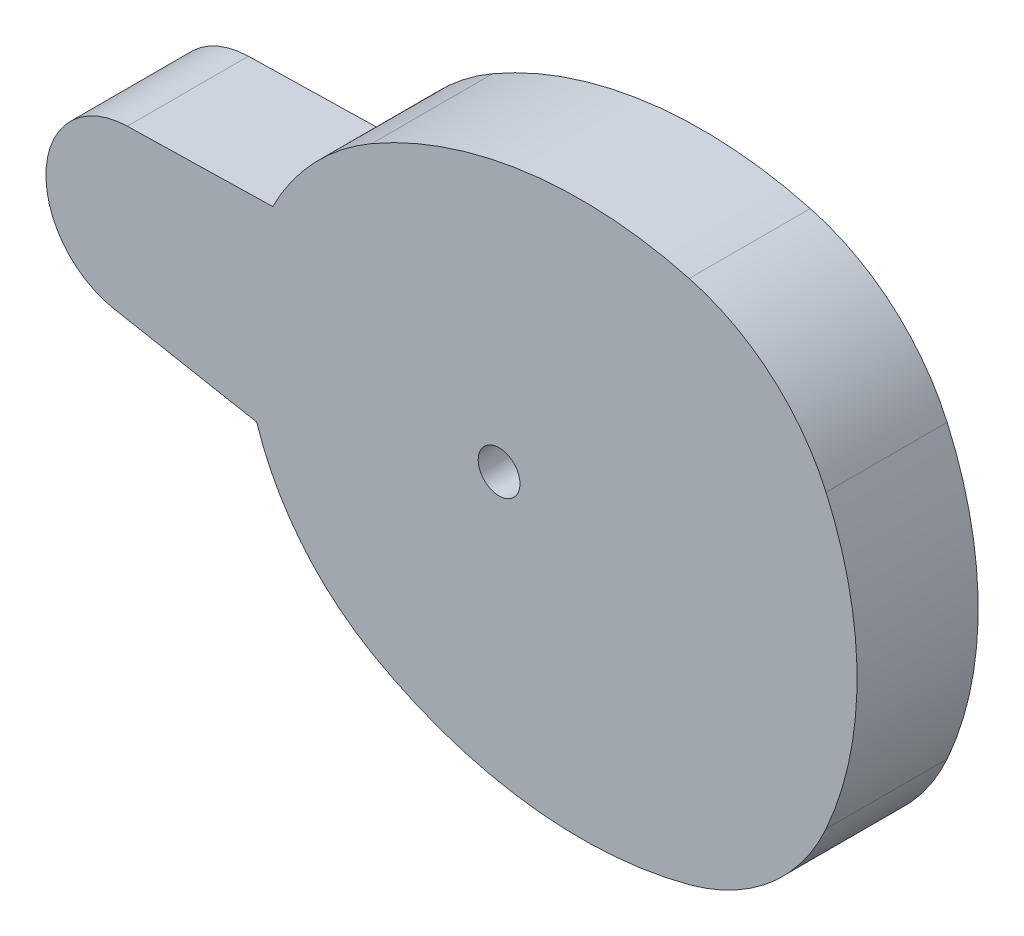
ISO-10303-21;
HEADER;
FILE_DESCRIPTION(('STEP AP214'),'2;1');
FILE_NAME('part.step','',(''),(''),'','','');
FILE_SCHEMA(('AUTOMOTIVE_DESIGN { 1 0 10303 214 1 1 1 1 }'));
ENDSEC;
DATA;
#1=APPLICATION_CONTEXT('core data for automotive mechanical design processes');
#2=APPLICATION_PROTOCOL_DEFINITION('international standard','automotive_design',2000,#1);
#3=PRODUCT_CONTEXT('',#1,'mechanical');
#4=PRODUCT('Part','Part','',(#3));
#5=PRODUCT_RELATED_PRODUCT_CATEGORY('part','',(#4));
#6=PRODUCT_DEFINITION_FORMATION('','',#4);
#7=PRODUCT_DEFINITION_CONTEXT('part definition',#1,'design');
#8=PRODUCT_DEFINITION('design','',#6,#7);
#9=PRODUCT_DEFINITION_SHAPE('','',#8);
#10=(LENGTH_UNIT() NAMED_UNIT(*) SI_UNIT(.MILLI.,.METRE.));
#11=(NAMED_UNIT(*) PLANE_ANGLE_UNIT() SI_UNIT($,.RADIAN.));
#12=(NAMED_UNIT(*) SI_UNIT($,.STERADIAN.) SOLID_ANGLE_UNIT());
#13=UNCERTAINTY_MEASURE_WITH_UNIT(LENGTH_MEASURE(1.E-05),#10,'distance_accuracy_value','');
#14=(GEOMETRIC_REPRESENTATION_CONTEXT(3) GLOBAL_UNCERTAINTY_ASSIGNED_CONTEXT((#13)) GLOBAL_UNIT_ASSIGNED_CONTEXT((#10,
#11,#12)) REPRESENTATION_CONTEXT('',''));
#15=CARTESIAN_POINT('',(0.,0.,0.));
#16=DIRECTION('',(0.,0.,1.));
#17=DIRECTION('',(1.,0.,0.));
#18=AXIS2_PLACEMENT_3D('',#15,#16,#17);
#19=CARTESIAN_POINT('',(-0.130507431467737,6.14233623483952,3.800000096));
#20=DIRECTION('',(-0.0212424032306193,0.999774354694592,0.));
#21=DIRECTION('',(-0.999774354694592,-0.0212424032306193,0.));
#22=AXIS2_PLACEMENT_3D('',#19,#20,#21);
#23=PLANE('',#22);
#24=DIRECTION('',(0.999774354694592,0.0212424032306193,0.));
#25=VECTOR('',#24,1.);
#26=CARTESIAN_POINT('',(-0.130507431467737,6.14233623483952,0.));
#27=LINE('',#26,#25);
#28=CARTESIAN_POINT('',(-33.5153313092147,5.43300228636977,0.));
#29=VERTEX_POINT('',#28);
#30=CARTESIAN_POINT('',(-26.5556302292879,5.5808764301805,0.));
#31=VERTEX_POINT('',#30);
#32=EDGE_CURVE('E211',#29,#31,#27,.T.);
#33=ORIENTED_EDGE('',*,*,#32,.F.);
#34=DIRECTION('',(0.,0.,-1.));
#35=VECTOR('',#34,1.);
#36=CARTESIAN_POINT('',(-33.5153313092147,5.43300228636977,3.800000096));
#37=LINE('',#36,#35);
#38=CARTESIAN_POINT('',(-33.5153313092147,5.43300228636977,5.800000096));
#39=VERTEX_POINT('',#38);
#40=EDGE_CURVE('E159',#39,#29,#37,.T.);
#41=ORIENTED_EDGE('',*,*,#40,.F.);
#42=DIRECTION('',(-0.999774354694592,-0.0212424032306193,0.));
#43=VECTOR('',#42,1.);
#44=CARTESIAN_POINT('',(-26.5556302292879,5.5808764301805,5.800000096));
#45=LINE('',#44,#43);
#46=CARTESIAN_POINT('',(-26.5556302292879,5.5808764301805,5.800000096));
#47=VERTEX_POINT('',#46);
#48=EDGE_CURVE('E158',#47,#39,#45,.T.);
#49=ORIENTED_EDGE('',*,*,#48,.F.);
#50=DIRECTION('',(0.,0.,-1.));
#51=VECTOR('',#50,1.);
#52=CARTESIAN_POINT('',(-26.5556302292879,5.5808764301805,3.800000096));
#53=LINE('',#52,#51);
#54=EDGE_CURVE('E143',#47,#31,#53,.T.);
#55=ORIENTED_EDGE('',*,*,#54,.T.);
#56=EDGE_LOOP('',(#33,#41,#49,#55));
#57=FACE_BOUND('',#56,.T.);
#58=ADVANCED_FACE('F39',(#57),#23,.T.);
#59=CARTESIAN_POINT('',(-33.4307610534729,1.45270062545966,3.800000096));
#60=DIRECTION('',(0.,0.,-1.));
#61=DIRECTION('',(-1.,0.,0.));
#62=AXIS2_PLACEMENT_3D('',#59,#60,#61);
#63=CYLINDRICAL_SURFACE('',#62,3.9812);
#64=CARTESIAN_POINT('',(-33.4307610534729,1.45270062545966,0.));
#65=DIRECTION('',(0.,0.,1.));
#66=DIRECTION('',(1.,0.,0.));
#67=AXIS2_PLACEMENT_3D('',#64,#65,#66);
#68=CIRCLE('',#67,3.9812);
#69=CARTESIAN_POINT('',(-34.1624423206417,-2.46068613836452,0.));
#70=VERTEX_POINT('',#69);
#71=EDGE_CURVE('E213',#29,#70,#68,.T.);
#72=ORIENTED_EDGE('',*,*,#71,.T.);
#73=DIRECTION('',(0.,0.,-1.));
#74=VECTOR('',#73,1.);
#75=CARTESIAN_POINT('',(-34.1624423206417,-2.46068613836452,3.800000096));
#76=LINE('',#75,#74);
#77=CARTESIAN_POINT('',(-34.1624423206417,-2.46068613836452,5.800000096));
#78=VERTEX_POINT('',#77);
#79=EDGE_CURVE('E237',#78,#70,#76,.T.);
#80=ORIENTED_EDGE('',*,*,#79,.F.);
#81=CARTESIAN_POINT('',(-33.4307610534729,1.45270062545966,5.800000096));
#82=DIRECTION('',(0.,0.,1.));
#83=DIRECTION('',(1.,0.,0.));
#84=AXIS2_PLACEMENT_3D('',#81,#82,#83);
#85=CIRCLE('',#84,3.9812);
#86=EDGE_CURVE('E162',#39,#78,#85,.T.);
#87=ORIENTED_EDGE('',*,*,#86,.F.);
#88=ORIENTED_EDGE('',*,*,#40,.T.);
#89=EDGE_LOOP('',(#72,#80,#87,#88));
#90=FACE_BOUND('',#89,.T.);
#91=ADVANCED_FACE('F277',(#90),#63,.T.);
#92=CARTESIAN_POINT('',(-1.59842292693316,-8.54914210043627,3.800000096));
#93=DIRECTION('',(0.183784102071938,0.982966634136486,0.));
#94=DIRECTION('',(-0.982966634136486,0.183784102071938,0.));
#95=AXIS2_PLACEMENT_3D('',#92,#93,#94);
#96=PLANE('',#95);
#97=DIRECTION('',(0.982966634136486,-0.183784102071938,0.));
#98=VECTOR('',#97,1.);
#99=CARTESIAN_POINT('',(-1.59842292693316,-8.54914210043627,0.));
#100=LINE('',#99,#98);
#101=CARTESIAN_POINT('',(-27.3197443528373,-3.74005723611003,0.));
#102=VERTEX_POINT('',#101);
#103=EDGE_CURVE('E216',#70,#102,#100,.T.);
#104=ORIENTED_EDGE('',*,*,#103,.T.);
#105=DIRECTION('',(0.,0.,-1.));
#106=VECTOR('',#105,1.);
#107=CARTESIAN_POINT('',(-27.3197443528373,-3.74005723611003,3.800000096));
#108=LINE('',#107,#106);
#109=CARTESIAN_POINT('',(-27.3197443528373,-3.74005723611003,5.800000096));
#110=VERTEX_POINT('',#109);
#111=EDGE_CURVE('E234',#110,#102,#108,.T.);
#112=ORIENTED_EDGE('',*,*,#111,.F.);
#113=DIRECTION('',(0.982966634136486,-0.183784102071938,0.));
#114=VECTOR('',#113,1.);
#115=CARTESIAN_POINT('',(-34.1624423206417,-2.46068613836452,5.800000096));
#116=LINE('',#115,#114);
#117=EDGE_CURVE('E175',#78,#110,#116,.T.);
#118=ORIENTED_EDGE('',*,*,#117,.F.);
#119=ORIENTED_EDGE('',*,*,#79,.T.);
#120=EDGE_LOOP('',(#104,#112,#118,#119));
#121=FACE_BOUND('',#120,.T.);
#122=ADVANCED_FACE('F275',(#121),#96,.F.);
#123=CARTESIAN_POINT('',(-15.7102062965589,0.,3.800000096));
#124=DIRECTION('',(0.,0.,-1.));
#125=DIRECTION('',(-1.,0.,0.));
#126=AXIS2_PLACEMENT_3D('',#123,#124,#125);
#127=CYLINDRICAL_SURFACE('',#126,12.1971062965589);
#128=CARTESIAN_POINT('',(-15.7102062965589,0.,0.));
#129=DIRECTION('',(0.,0.,1.));
#130=DIRECTION('',(1.,0.,0.));
#131=AXIS2_PLACEMENT_3D('',#128,#129,#130);
#132=CIRCLE('',#131,12.1971062965589);
#133=CARTESIAN_POINT('',(-21.8087594448383,-10.5630039054791,0.));
#134=VERTEX_POINT('',#133);
#135=EDGE_CURVE('E219',#102,#134,#132,.T.);
#136=ORIENTED_EDGE('',*,*,#135,.T.);
#137=DIRECTION('',(0.,0.,-1.));
#138=VECTOR('',#137,1.);
#139=CARTESIAN_POINT('',(-21.8087594448383,-10.5630039054791,3.800000096));
#140=LINE('',#139,#138);
#141=CARTESIAN_POINT('',(-21.8087594448383,-10.5630039054791,5.800000096));
#142=VERTEX_POINT('',#141);
#143=EDGE_CURVE('E231',#142,#134,#140,.T.);
#144=ORIENTED_EDGE('',*,*,#143,.F.);
#145=CARTESIAN_POINT('',(-15.7102062965589,0.,5.800000096));
#146=DIRECTION('',(0.,0.,1.));
#147=DIRECTION('',(1.,0.,0.));
#148=AXIS2_PLACEMENT_3D('',#145,#146,#147);
#149=CIRCLE('',#148,12.1971062965589);
#150=EDGE_CURVE('E178',#110,#142,#149,.T.);
#151=ORIENTED_EDGE('',*,*,#150,.F.);
#152=ORIENTED_EDGE('',*,*,#111,.T.);
#153=EDGE_LOOP('',(#136,#144,#151,#152));
#154=FACE_BOUND('',#153,.T.);
#155=ADVANCED_FACE('F271',(#154),#127,.T.);
#156=CARTESIAN_POINT('',(-11.7790750223731,6.80891909811276,3.800000096));
#157=DIRECTION('',(0.,0.,-1.));
#158=DIRECTION('',(-1.,0.,0.));
#159=AXIS2_PLACEMENT_3D('',#156,#157,#158);
#160=CYLINDRICAL_SURFACE('',#159,20.0593688449304);
#161=CARTESIAN_POINT('',(-11.7790750223731,6.80891909811276,0.));
#162=DIRECTION('',(0.,0.,1.));
#163=DIRECTION('',(1.,0.,0.));
#164=AXIS2_PLACEMENT_3D('',#161,#162,#163);
#165=CIRCLE('',#164,20.0593688449304);
#166=CARTESIAN_POINT('',(-6.60489916377206,-12.5716428813871,0.));
#167=VERTEX_POINT('',#166);
#168=EDGE_CURVE('E222',#134,#167,#165,.T.);
#169=ORIENTED_EDGE('',*,*,#168,.T.);
#170=DIRECTION('',(0.,0.,-1.));
#171=VECTOR('',#170,1.);
#172=CARTESIAN_POINT('',(-6.60489916377206,-12.5716428813871,3.800000096));
#173=LINE('',#172,#171);
#174=CARTESIAN_POINT('',(-6.60489916377206,-12.5716428813871,5.800000096));
#175=VERTEX_POINT('',#174);
#176=EDGE_CURVE('E62',#167,#175,#173,.F.);
#177=ORIENTED_EDGE('',*,*,#176,.T.);
#178=CARTESIAN_POINT('',(-11.7790750223731,6.80891909811276,5.800000096));
#179=DIRECTION('',(0.,0.,1.));
#180=DIRECTION('',(1.,0.,0.));
#181=AXIS2_PLACEMENT_3D('',#178,#179,#180);
#182=CIRCLE('',#181,20.0593688449304);
#183=EDGE_CURVE('E181',#142,#175,#182,.T.);
#184=ORIENTED_EDGE('',*,*,#183,.F.);
#185=ORIENTED_EDGE('',*,*,#143,.T.);
#186=EDGE_LOOP('',(#169,#177,#184,#185));
#187=FACE_BOUND('',#186,.T.);
#188=ADVANCED_FACE('F268',(#187),#160,.T.);
#189=CARTESIAN_POINT('',(-15.7102062965589,0.,3.800000096));
#190=DIRECTION('',(0.,0.,-1.));
#191=DIRECTION('',(-1.,0.,0.));
#192=AXIS2_PLACEMENT_3D('',#189,#190,#191);
#193=CYLINDRICAL_SURFACE('',#192,17.1453062965589);
#194=CARTESIAN_POINT('',(-15.7102062965589,0.,5.800000096));
#195=DIRECTION('',(0.,0.,1.));
#196=DIRECTION('',(1.,0.,0.));
#197=AXIS2_PLACEMENT_3D('',#194,#195,#196);
#198=CIRCLE('',#197,17.1453062965589);
#199=CARTESIAN_POINT('',(-0.0512352367083545,-6.98270387096467,5.800000096));
#200=VERTEX_POINT('',#199);
#201=CARTESIAN_POINT('',(-0.0512352367083545,6.98270387096467,5.800000096));
#202=VERTEX_POINT('',#201);
#203=EDGE_CURVE('E183',#200,#202,#198,.T.);
#204=ORIENTED_EDGE('',*,*,#203,.F.);
#205=DIRECTION('',(0.,0.,-1.));
#206=VECTOR('',#205,1.);
#207=CARTESIAN_POINT('',(-0.0512352367083475,-6.98270387096467,3.800000096));
#208=LINE('',#207,#206);
#209=CARTESIAN_POINT('',(-0.051235236708351,-6.98270387096467,0.));
#210=VERTEX_POINT('',#209);
#211=EDGE_CURVE('E249',#200,#210,#208,.T.);
#212=ORIENTED_EDGE('',*,*,#211,.T.);
#213=CARTESIAN_POINT('',(-15.7102062965589,0.,0.));
#214=DIRECTION('',(0.,0.,1.));
#215=DIRECTION('',(1.,0.,0.));
#216=AXIS2_PLACEMENT_3D('',#213,#214,#215);
#217=CIRCLE('',#216,17.1453062965589);
#218=CARTESIAN_POINT('',(-0.051235236708351,6.98270387096467,0.));
#219=VERTEX_POINT('',#218);
#220=EDGE_CURVE('E224',#210,#219,#217,.T.);
#221=ORIENTED_EDGE('',*,*,#220,.T.);
#222=DIRECTION('',(0.,0.,-1.));
#223=VECTOR('',#222,1.);
#224=CARTESIAN_POINT('',(-0.0512352367083475,6.98270387096467,3.800000096));
#225=LINE('',#224,#223);
#226=EDGE_CURVE('E241',#219,#202,#225,.F.);
#227=ORIENTED_EDGE('',*,*,#226,.T.);
#228=EDGE_LOOP('',(#204,#212,#221,#227));
#229=FACE_BOUND('',#228,.T.);
#230=ADVANCED_FACE('F262',(#229),#193,.T.);
#231=CARTESIAN_POINT('',(-11.7790750223731,-6.80891909811276,3.800000096));
#232=DIRECTION('',(0.,0.,-1.));
#233=DIRECTION('',(-1.,0.,0.));
#234=AXIS2_PLACEMENT_3D('',#231,#232,#233);
#235=CYLINDRICAL_SURFACE('',#234,20.0593688449304);
#236=CARTESIAN_POINT('',(-11.7790750223731,-6.80891909811276,5.800000096));
#237=DIRECTION('',(0.,0.,1.));
#238=DIRECTION('',(1.,0.,0.));
#239=AXIS2_PLACEMENT_3D('',#236,#237,#238);
#240=CIRCLE('',#239,20.0593688449304);
#241=CARTESIAN_POINT('',(-6.60489916377206,12.5716428813871,5.800000096));
#242=VERTEX_POINT('',#241);
#243=CARTESIAN_POINT('',(-21.8087594448383,10.5630039054791,5.800000096));
#244=VERTEX_POINT('',#243);
#245=EDGE_CURVE('E165',#242,#244,#240,.T.);
#246=ORIENTED_EDGE('',*,*,#245,.F.);
#247=DIRECTION('',(0.,0.,-1.));
#248=VECTOR('',#247,1.);
#249=CARTESIAN_POINT('',(-6.60489916377206,12.5716428813871,3.800000096));
#250=LINE('',#249,#248);
#251=CARTESIAN_POINT('',(-6.60489916377206,12.5716428813871,0.));
#252=VERTEX_POINT('',#251);
#253=EDGE_CURVE('E11',#242,#252,#250,.T.);
#254=ORIENTED_EDGE('',*,*,#253,.T.);
#255=CARTESIAN_POINT('',(-11.7790750223731,-6.80891909811276,0.));
#256=DIRECTION('',(0.,0.,1.));
#257=DIRECTION('',(1.,0.,0.));
#258=AXIS2_PLACEMENT_3D('',#255,#256,#257);
#259=CIRCLE('',#258,20.0593688449304);
#260=CARTESIAN_POINT('',(-21.8087594448383,10.5630039054791,0.));
#261=VERTEX_POINT('',#260);
#262=EDGE_CURVE('E227',#252,#261,#259,.T.);
#263=ORIENTED_EDGE('',*,*,#262,.T.);
#264=DIRECTION('',(0.,0.,-1.));
#265=VECTOR('',#264,1.);
#266=CARTESIAN_POINT('',(-21.8087594448383,10.5630039054791,3.800000096));
#267=LINE('',#266,#265);
#268=EDGE_CURVE('E154',#244,#261,#267,.T.);
#269=ORIENTED_EDGE('',*,*,#268,.F.);
#270=EDGE_LOOP('',(#246,#254,#263,#269));
#271=FACE_BOUND('',#270,.T.);
#272=ADVANCED_FACE('F304',(#271),#235,.T.);
#273=CARTESIAN_POINT('',(-15.7102062965589,0.,3.800000096));
#274=DIRECTION('',(0.,0.,-1.));
#275=DIRECTION('',(-1.,0.,0.));
#276=AXIS2_PLACEMENT_3D('',#273,#274,#275);
#277=CYLINDRICAL_SURFACE('',#276,3.81);
#278=CARTESIAN_POINT('',(-15.7102062965589,0.,0.));
#279=DIRECTION('',(0.,0.,1.));
#280=DIRECTION('',(1.,0.,0.));
#281=AXIS2_PLACEMENT_3D('',#278,#279,#280);
#282=CIRCLE('',#281,3.81);
#283=CARTESIAN_POINT('',(-16.4104237254529,-3.74510287606001,0.));
#284=VERTEX_POINT('',#283);
#285=CARTESIAN_POINT('',(-15.7911398528675,3.80914029138639,0.));
#286=VERTEX_POINT('',#285);
#287=EDGE_CURVE('E186',#284,#286,#282,.T.);
#288=ORIENTED_EDGE('',*,*,#287,.F.);
#289=DIRECTION('',(0.,0.,-1.));
#290=VECTOR('',#289,1.);
#291=CARTESIAN_POINT('',(-16.4104237254529,-3.74510287606001,3.800000096));
#292=LINE('',#291,#290);
#293=CARTESIAN_POINT('',(-16.4104237254529,-3.74510287606001,3.800000096));
#294=VERTEX_POINT('',#293);
#295=EDGE_CURVE('E155',#294,#284,#292,.T.);
#296=ORIENTED_EDGE('',*,*,#295,.F.);
#297=CARTESIAN_POINT('',(-15.7102062965589,0.,3.800000096));
#298=DIRECTION('',(0.,0.,1.));
#299=DIRECTION('',(1.,0.,0.));
#300=AXIS2_PLACEMENT_3D('',#297,#298,#299);
#301=CIRCLE('',#300,3.81);
#302=CARTESIAN_POINT('',(-15.7911398528675,3.80914029138639,3.800000096));
#303=VERTEX_POINT('',#302);
#304=EDGE_CURVE('E187',#294,#303,#301,.T.);
#305=ORIENTED_EDGE('',*,*,#304,.T.);
#306=DIRECTION('',(0.,0.,-1.));
#307=VECTOR('',#306,1.);
#308=CARTESIAN_POINT('',(-15.7911398528675,3.80914029138639,3.800000096));
#309=LINE('',#308,#307);
#310=EDGE_CURVE('E199',#303,#286,#309,.T.);
#311=ORIENTED_EDGE('',*,*,#310,.T.);
#312=EDGE_LOOP('',(#288,#296,#305,#311));
#313=FACE_BOUND('',#312,.T.);
#314=ADVANCED_FACE('F301',(#313),#277,.F.);
#315=CARTESIAN_POINT('',(-1.23085472278928,-6.5832088321633,3.800000096));
#316=DIRECTION('',(0.183784102071938,0.982966634136486,0.));
#317=DIRECTION('',(-0.982966634136486,0.183784102071938,0.));
#318=AXIS2_PLACEMENT_3D('',#315,#316,#317);
#319=PLANE('',#318);
#320=DIRECTION('',(0.982966634136486,-0.183784102071938,0.));
#321=VECTOR('',#320,1.);
#322=CARTESIAN_POINT('',(-1.23085472278928,-6.5832088321633,0.));
#323=LINE('',#322,#321);
#324=CARTESIAN_POINT('',(-33.7948741164978,-0.494752870091543,0.));
#325=VERTEX_POINT('',#324);
#326=EDGE_CURVE('E202',#325,#284,#323,.T.);
#327=ORIENTED_EDGE('',*,*,#326,.F.);
#328=DIRECTION('',(0.,0.,-1.));
#329=VECTOR('',#328,1.);
#330=CARTESIAN_POINT('',(-33.7948741164978,-0.494752870091543,3.800000096));
#331=LINE('',#330,#329);
#332=CARTESIAN_POINT('',(-33.7948741164978,-0.494752870091543,3.800000096));
#333=VERTEX_POINT('',#332);
#334=EDGE_CURVE('E245',#333,#325,#331,.T.);
#335=ORIENTED_EDGE('',*,*,#334,.F.);
#336=DIRECTION('',(0.982966634136486,-0.183784102071938,0.));
#337=VECTOR('',#336,1.);
#338=CARTESIAN_POINT('',(-1.23085472278928,-6.5832088321633,3.800000096));
#339=LINE('',#338,#337);
#340=EDGE_CURVE('E190',#333,#294,#339,.T.);
#341=ORIENTED_EDGE('',*,*,#340,.T.);
#342=ORIENTED_EDGE('',*,*,#295,.T.);
#343=EDGE_LOOP('',(#327,#335,#341,#342));
#344=FACE_BOUND('',#343,.T.);
#345=ADVANCED_FACE('F297',(#344),#319,.T.);
#346=CARTESIAN_POINT('',(-33.4307610534729,1.45270062545966,3.800000096));
#347=DIRECTION('',(0.,0.,-1.));
#348=DIRECTION('',(-1.,0.,0.));
#349=AXIS2_PLACEMENT_3D('',#346,#347,#348);
#350=CYLINDRICAL_SURFACE('',#349,1.9812);
#351=CARTESIAN_POINT('',(-33.4307610534729,1.45270062545966,0.));
#352=DIRECTION('',(0.,0.,1.));
#353=DIRECTION('',(1.,0.,0.));
#354=AXIS2_PLACEMENT_3D('',#351,#352,#353);
#355=CIRCLE('',#354,1.9812);
#356=CARTESIAN_POINT('',(-33.4728465027534,3.43345357698058,0.));
#357=VERTEX_POINT('',#356);
#358=EDGE_CURVE('E205',#357,#325,#355,.T.);
#359=ORIENTED_EDGE('',*,*,#358,.F.);
#360=DIRECTION('',(0.,0.,-1.));
#361=VECTOR('',#360,1.);
#362=CARTESIAN_POINT('',(-33.4728465027534,3.43345357698058,3.800000096));
#363=LINE('',#362,#361);
#364=CARTESIAN_POINT('',(-33.4728465027534,3.43345357698058,3.800000096));
#365=VERTEX_POINT('',#364);
#366=EDGE_CURVE('E243',#365,#357,#363,.T.);
#367=ORIENTED_EDGE('',*,*,#366,.F.);
#368=CARTESIAN_POINT('',(-33.4307610534729,1.45270062545966,3.800000096));
#369=DIRECTION('',(0.,0.,1.));
#370=DIRECTION('',(1.,0.,0.));
#371=AXIS2_PLACEMENT_3D('',#368,#369,#370);
#372=CIRCLE('',#371,1.9812);
#373=EDGE_CURVE('E193',#365,#333,#372,.T.);
#374=ORIENTED_EDGE('',*,*,#373,.T.);
#375=ORIENTED_EDGE('',*,*,#334,.T.);
#376=EDGE_LOOP('',(#359,#367,#374,#375));
#377=FACE_BOUND('',#376,.T.);
#378=ADVANCED_FACE('F293',(#377),#350,.F.);
#379=CARTESIAN_POINT('',(-0.0880226250064986,4.14278752545033,3.800000096));
#380=DIRECTION('',(0.0212424032306195,-0.999774354694592,0.));
#381=DIRECTION('',(0.999774354694592,0.0212424032306195,0.));
#382=AXIS2_PLACEMENT_3D('',#379,#380,#381);
#383=PLANE('',#382);
#384=DIRECTION('',(-0.999774354694592,-0.0212424032306195,0.));
#385=VECTOR('',#384,1.);
#386=CARTESIAN_POINT('',(-0.0880226250064986,4.14278752545033,0.));
#387=LINE('',#386,#385);
#388=EDGE_CURVE('E208',#286,#357,#387,.T.);
#389=ORIENTED_EDGE('',*,*,#388,.F.);
#390=ORIENTED_EDGE('',*,*,#310,.F.);
#391=DIRECTION('',(-0.999774354694592,-0.0212424032306195,0.));
#392=VECTOR('',#391,1.);
#393=CARTESIAN_POINT('',(-0.0880226250064986,4.14278752545033,3.800000096));
#394=LINE('',#393,#392);
#395=EDGE_CURVE('E196',#303,#365,#394,.T.);
#396=ORIENTED_EDGE('',*,*,#395,.T.);
#397=ORIENTED_EDGE('',*,*,#366,.T.);
#398=EDGE_LOOP('',(#389,#390,#396,#397));
#399=FACE_BOUND('',#398,.T.);
#400=ADVANCED_FACE('F290',(#399),#383,.T.);
#401=CARTESIAN_POINT('',(-15.7102062965589,0.,3.800000096));
#402=DIRECTION('',(0.,0.,-1.));
#403=DIRECTION('',(-1.,0.,0.));
#404=AXIS2_PLACEMENT_3D('',#401,#402,#403);
#405=CYLINDRICAL_SURFACE('',#404,12.1971062965589);
#406=CARTESIAN_POINT('',(-15.7102062965589,0.,0.));
#407=DIRECTION('',(0.,0.,1.));
#408=DIRECTION('',(1.,0.,0.));
#409=AXIS2_PLACEMENT_3D('',#406,#407,#408);
#410=CIRCLE('',#409,12.1971062965589);
#411=EDGE_CURVE('E150',#261,#31,#410,.T.);
#412=ORIENTED_EDGE('',*,*,#411,.T.);
#413=ORIENTED_EDGE('',*,*,#54,.F.);
#414=CARTESIAN_POINT('',(-15.7102062965589,0.,5.800000096));
#415=DIRECTION('',(0.,0.,1.));
#416=DIRECTION('',(1.,0.,0.));
#417=AXIS2_PLACEMENT_3D('',#414,#415,#416);
#418=CIRCLE('',#417,12.1971062965589);
#419=EDGE_CURVE('E148',#244,#47,#418,.T.);
#420=ORIENTED_EDGE('',*,*,#419,.F.);
#421=ORIENTED_EDGE('',*,*,#268,.T.);
#422=EDGE_LOOP('',(#412,#413,#420,#421));
#423=FACE_BOUND('',#422,.T.);
#424=ADVANCED_FACE('F145',(#423),#405,.T.);
#425=CARTESIAN_POINT('',(0.,0.,0.));
#426=DIRECTION('',(0.,0.,1.));
#427=DIRECTION('',(1.,0.,0.));
#428=AXIS2_PLACEMENT_3D('',#425,#426,#427);
#429=PLANE('',#428);
#430=ORIENTED_EDGE('',*,*,#287,.T.);
#431=ORIENTED_EDGE('',*,*,#388,.T.);
#432=ORIENTED_EDGE('',*,*,#358,.T.);
#433=ORIENTED_EDGE('',*,*,#326,.T.);
#434=EDGE_LOOP('',(#430,#431,#432,#433));
#435=FACE_BOUND('',#434,.T.);
#436=ORIENTED_EDGE('',*,*,#220,.F.);
#437=CARTESIAN_POINT('',(-9.18433020100965,-2.91004179646669,0.));
#438=DIRECTION('',(0.,0.,1.));
#439=DIRECTION('',(1.,0.,0.));
#440=AXIS2_PLACEMENT_3D('',#437,#438,#439);
#441=CIRCLE('',#440,10.);
#442=EDGE_CURVE('E254',#210,#167,#441,.F.);
#443=ORIENTED_EDGE('',*,*,#442,.T.);
#444=ORIENTED_EDGE('',*,*,#168,.F.);
#445=ORIENTED_EDGE('',*,*,#135,.F.);
#446=ORIENTED_EDGE('',*,*,#103,.F.);
#447=ORIENTED_EDGE('',*,*,#71,.F.);
#448=ORIENTED_EDGE('',*,*,#32,.T.);
#449=ORIENTED_EDGE('',*,*,#411,.F.);
#450=ORIENTED_EDGE('',*,*,#262,.F.);
#451=CARTESIAN_POINT('',(-9.18433020100965,2.91004179646669,0.));
#452=DIRECTION('',(0.,0.,1.));
#453=DIRECTION('',(1.,0.,0.));
#454=AXIS2_PLACEMENT_3D('',#451,#452,#453);
#455=CIRCLE('',#454,10.);
#456=EDGE_CURVE('E252',#252,#219,#455,.F.);
#457=ORIENTED_EDGE('',*,*,#456,.T.);
#458=EDGE_LOOP('',(#436,#443,#444,#445,#446,#447,#448,#449,#450,#457));
#459=FACE_BOUND('',#458,.T.);
#460=ADVANCED_FACE('F267',(#435,#459),#429,.F.);
#461=CARTESIAN_POINT('',(-15.7102062965589,0.,3.800000096));
#462=DIRECTION('',(0.,0.,1.));
#463=DIRECTION('',(1.,0.,0.));
#464=AXIS2_PLACEMENT_3D('',#461,#462,#463);
#465=PLANE('',#464);
#466=CARTESIAN_POINT('',(-15.7102062965589,0.,3.800000096));
#467=DIRECTION('',(0.,0.,1.));
#468=DIRECTION('',(1.,0.,0.));
#469=AXIS2_PLACEMENT_3D('',#466,#467,#468);
#470=CIRCLE('',#469,1.);
#471=CARTESIAN_POINT('',(-14.7102062965589,0.,3.800000096));
#472=VERTEX_POINT('',#471);
#473=EDGE_CURVE('E167',#472,#472,#470,.T.);
#474=ORIENTED_EDGE('',*,*,#473,.T.);
#475=EDGE_LOOP('',(#474));
#476=FACE_BOUND('',#475,.T.);
#477=ORIENTED_EDGE('',*,*,#304,.F.);
#478=ORIENTED_EDGE('',*,*,#340,.F.);
#479=ORIENTED_EDGE('',*,*,#373,.F.);
#480=ORIENTED_EDGE('',*,*,#395,.F.);
#481=EDGE_LOOP('',(#477,#478,#479,#480));
#482=FACE_BOUND('',#481,.T.);
#483=ADVANCED_FACE('F314',(#476,#482),#465,.F.);
#484=CARTESIAN_POINT('',(-15.7102062965589,0.,5.800000096));
#485=DIRECTION('',(0.,0.,1.));
#486=DIRECTION('',(1.,0.,0.));
#487=AXIS2_PLACEMENT_3D('',#484,#485,#486);
#488=PLANE('',#487);
#489=CARTESIAN_POINT('',(-15.7102062965589,0.,5.800000096));
#490=DIRECTION('',(0.,0.,-1.));
#491=DIRECTION('',(-1.,0.,0.));
#492=AXIS2_PLACEMENT_3D('',#489,#490,#491);
#493=CIRCLE('',#492,1.);
#494=CARTESIAN_POINT('',(-16.7102062965589,0.,5.800000096));
#495=VERTEX_POINT('',#494);
#496=EDGE_CURVE('E170',#495,#495,#493,.T.);
#497=ORIENTED_EDGE('',*,*,#496,.T.);
#498=EDGE_LOOP('',(#497));
#499=FACE_BOUND('',#498,.T.);
#500=ORIENTED_EDGE('',*,*,#183,.T.);
#501=CARTESIAN_POINT('',(-9.18433020100965,-2.91004179646669,5.800000096));
#502=DIRECTION('',(0.,0.,1.));
#503=DIRECTION('',(1.,0.,0.));
#504=AXIS2_PLACEMENT_3D('',#501,#502,#503);
#505=CIRCLE('',#504,10.);
#506=EDGE_CURVE('E47',#175,#200,#505,.T.);
#507=ORIENTED_EDGE('',*,*,#506,.T.);
#508=ORIENTED_EDGE('',*,*,#203,.T.);
#509=CARTESIAN_POINT('',(-9.18433020100965,2.91004179646669,5.800000096));
#510=DIRECTION('',(0.,0.,1.));
#511=DIRECTION('',(1.,0.,0.));
#512=AXIS2_PLACEMENT_3D('',#509,#510,#511);
#513=CIRCLE('',#512,10.);
#514=EDGE_CURVE('E54',#202,#242,#513,.T.);
#515=ORIENTED_EDGE('',*,*,#514,.T.);
#516=ORIENTED_EDGE('',*,*,#245,.T.);
#517=ORIENTED_EDGE('',*,*,#419,.T.);
#518=ORIENTED_EDGE('',*,*,#48,.T.);
#519=ORIENTED_EDGE('',*,*,#86,.T.);
#520=ORIENTED_EDGE('',*,*,#117,.T.);
#521=ORIENTED_EDGE('',*,*,#150,.T.);
#522=EDGE_LOOP('',(#500,#507,#508,#515,#516,#517,#518,#519,#520,#521));
#523=FACE_BOUND('',#522,.T.);
#524=ADVANCED_FACE('F164',(#499,#523),#488,.T.);
#525=CARTESIAN_POINT('',(-9.18433020100965,-2.91004179646669,3.800000096));
#526=DIRECTION('',(0.,0.,-1.));
#527=DIRECTION('',(-1.,0.,0.));
#528=AXIS2_PLACEMENT_3D('',#525,#526,#527);
#529=CYLINDRICAL_SURFACE('',#528,10.);
#530=ORIENTED_EDGE('',*,*,#506,.F.);
#531=ORIENTED_EDGE('',*,*,#176,.F.);
#532=ORIENTED_EDGE('',*,*,#442,.F.);
#533=ORIENTED_EDGE('',*,*,#211,.F.);
#534=EDGE_LOOP('',(#530,#531,#532,#533));
#535=FACE_BOUND('',#534,.T.);
#536=ADVANCED_FACE('F265',(#535),#529,.T.);
#537=CARTESIAN_POINT('',(-9.18433020100965,2.91004179646669,3.800000096));
#538=DIRECTION('',(0.,0.,-1.));
#539=DIRECTION('',(-1.,0.,0.));
#540=AXIS2_PLACEMENT_3D('',#537,#538,#539);
#541=CYLINDRICAL_SURFACE('',#540,10.);
#542=ORIENTED_EDGE('',*,*,#514,.F.);
#543=ORIENTED_EDGE('',*,*,#226,.F.);
#544=ORIENTED_EDGE('',*,*,#456,.F.);
#545=ORIENTED_EDGE('',*,*,#253,.F.);
#546=EDGE_LOOP('',(#542,#543,#544,#545));
#547=FACE_BOUND('',#546,.T.);
#548=ADVANCED_FACE('F41',(#547),#541,.T.);
#549=CARTESIAN_POINT('',(-15.7102062965589,0.,5.800000096));
#550=DIRECTION('',(0.,0.,-1.));
#551=DIRECTION('',(-1.,0.,0.));
#552=AXIS2_PLACEMENT_3D('',#549,#550,#551);
#553=CYLINDRICAL_SURFACE('',#552,1.);
#554=ORIENTED_EDGE('',*,*,#496,.F.);
#555=EDGE_LOOP('',(#554));
#556=FACE_BOUND('',#555,.T.);
#557=ORIENTED_EDGE('',*,*,#473,.F.);
#558=EDGE_LOOP('',(#557));
#559=FACE_BOUND('',#558,.T.);
#560=ADVANCED_FACE('F311',(#556,#559),#553,.F.);
#561=CLOSED_SHELL('',(#58,#91,#122,#155,#188,#230,#272,#314,#345,#378,#400,#424,#460,#483,#524,
#536,#548,#560));
#562=MANIFOLD_SOLID_BREP('B2',#561);
#563=ADVANCED_BREP_SHAPE_REPRESENTATION('',(#18,#562),#14);
#564=SHAPE_DEFINITION_REPRESENTATION(#9,#563);
ENDSEC;
END-ISO-10303-21;
